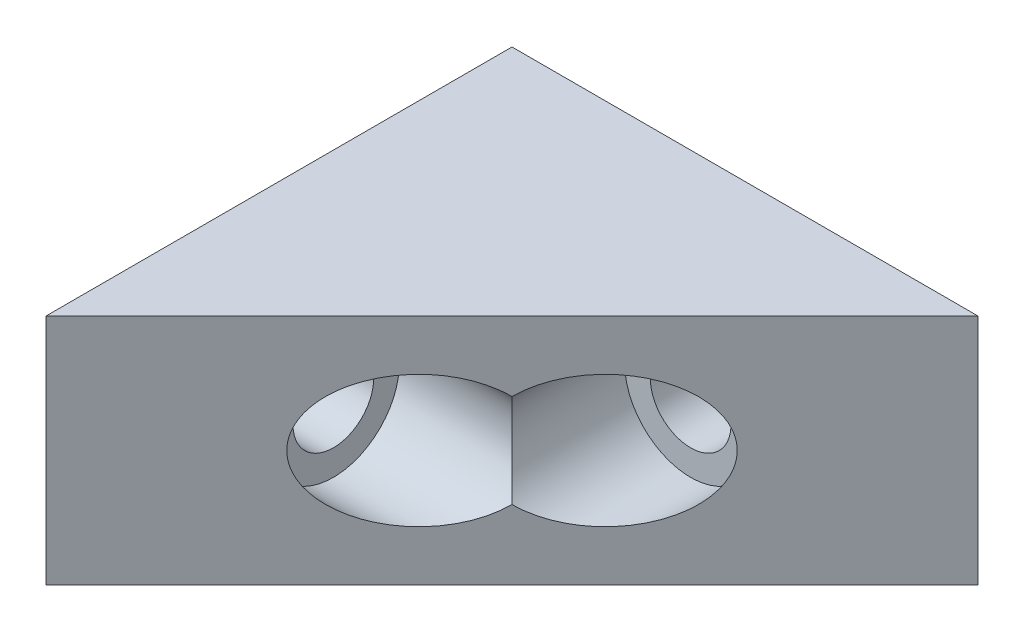
ISO-10303-21;
HEADER;
FILE_DESCRIPTION(('STEP AP214'),'2;1');
FILE_NAME('part.step','',(''),(''),'','','');
FILE_SCHEMA(('AUTOMOTIVE_DESIGN { 1 0 10303 214 1 1 1 1 }'));
ENDSEC;
DATA;
#1=APPLICATION_CONTEXT('core data for automotive mechanical design processes');
#2=APPLICATION_PROTOCOL_DEFINITION('international standard','automotive_design',2000,#1);
#3=PRODUCT_CONTEXT('',#1,'mechanical');
#4=PRODUCT('Part','Part','',(#3));
#5=PRODUCT_RELATED_PRODUCT_CATEGORY('part','',(#4));
#6=PRODUCT_DEFINITION_FORMATION('','',#4);
#7=PRODUCT_DEFINITION_CONTEXT('part definition',#1,'design');
#8=PRODUCT_DEFINITION('design','',#6,#7);
#9=PRODUCT_DEFINITION_SHAPE('','',#8);
#10=(LENGTH_UNIT() NAMED_UNIT(*) SI_UNIT(.MILLI.,.METRE.));
#11=(NAMED_UNIT(*) PLANE_ANGLE_UNIT() SI_UNIT($,.RADIAN.));
#12=(NAMED_UNIT(*) SI_UNIT($,.STERADIAN.) SOLID_ANGLE_UNIT());
#13=UNCERTAINTY_MEASURE_WITH_UNIT(LENGTH_MEASURE(1.E-05),#10,'distance_accuracy_value','');
#14=(GEOMETRIC_REPRESENTATION_CONTEXT(3) GLOBAL_UNCERTAINTY_ASSIGNED_CONTEXT((#13)) GLOBAL_UNIT_ASSIGNED_CONTEXT((#10,
#11,#12)) REPRESENTATION_CONTEXT('',''));
#15=CARTESIAN_POINT('',(0.,0.,0.));
#16=DIRECTION('',(0.,0.,1.));
#17=DIRECTION('',(1.,0.,0.));
#18=AXIS2_PLACEMENT_3D('',#15,#16,#17);
#19=CARTESIAN_POINT('',(-8.625,7.5,12.225));
#20=DIRECTION('',(1.,0.,0.));
#21=DIRECTION('',(0.,0.,-1.));
#22=AXIS2_PLACEMENT_3D('',#19,#20,#21);
#23=CYLINDRICAL_SURFACE('',#22,4.25);
#24=CARTESIAN_POINT('',(-8.625,7.5,12.225));
#25=DIRECTION('',(-1.,0.,0.));
#26=DIRECTION('',(0.,0.,1.));
#27=AXIS2_PLACEMENT_3D('',#24,#25,#26);
#28=CIRCLE('',#27,4.25);
#29=CARTESIAN_POINT('',(-8.625,7.5,16.475));
#30=VERTEX_POINT('',#29);
#31=EDGE_CURVE('E100',#30,#30,#28,.T.);
#32=ORIENTED_EDGE('',*,*,#31,.T.);
#33=EDGE_LOOP('',(#32));
#34=FACE_BOUND('',#33,.T.);
#35=CARTESIAN_POINT('',(-3.12499999999999,7.5,12.225));
#36=DIRECTION('',(-0.707106781186548,0.,-0.707106781186547));
#37=DIRECTION('',(0.707106781186547,0.,-0.707106781186548));
#38=AXIS2_PLACEMENT_3D('',#35,#36,#37);
#39=ELLIPSE('',#38,6.01040764008565,4.25);
#40=CARTESIAN_POINT('',(-0.124999999999998,10.5103986446981,9.22500000000002));
#41=VERTEX_POINT('',#40);
#42=CARTESIAN_POINT('',(-0.124999999999998,4.48960135530192,9.22500000000002));
#43=VERTEX_POINT('',#42);
#44=EDGE_CURVE('E94',#41,#43,#39,.F.);
#45=ORIENTED_EDGE('',*,*,#44,.T.);
#46=CARTESIAN_POINT('',(2.875,7.5,12.225));
#47=DIRECTION('',(0.707106781186547,0.,-0.707106781186548));
#48=DIRECTION('',(0.707106781186548,0.,0.707106781186547));
#49=AXIS2_PLACEMENT_3D('',#46,#47,#48);
#50=ELLIPSE('',#49,6.01040764008565,4.25);
#51=EDGE_CURVE('E11',#43,#41,#50,.T.);
#52=ORIENTED_EDGE('',*,*,#51,.T.);
#53=EDGE_LOOP('',(#45,#52));
#54=FACE_BOUND('',#53,.T.);
#55=ADVANCED_FACE('F39',(#34,#54),#23,.F.);
#56=CARTESIAN_POINT('',(2.875,7.5,24.225));
#57=DIRECTION('',(0.,0.,-1.));
#58=DIRECTION('',(-1.,0.,0.));
#59=AXIS2_PLACEMENT_3D('',#56,#57,#58);
#60=CYLINDRICAL_SURFACE('',#59,2.6);
#61=CARTESIAN_POINT('',(2.875,7.5,0.725000000000024));
#62=DIRECTION('',(0.,0.,-1.));
#63=DIRECTION('',(-1.,0.,0.));
#64=AXIS2_PLACEMENT_3D('',#61,#62,#63);
#65=CIRCLE('',#64,2.6);
#66=CARTESIAN_POINT('',(0.274999999999996,7.5,0.725000000000024));
#67=VERTEX_POINT('',#66);
#68=EDGE_CURVE('E43',#67,#67,#65,.F.);
#69=ORIENTED_EDGE('',*,*,#68,.T.);
#70=EDGE_LOOP('',(#69));
#71=FACE_BOUND('',#70,.T.);
#72=CARTESIAN_POINT('',(2.875,7.5,-5.77499999999998));
#73=DIRECTION('',(0.,0.,-1.));
#74=DIRECTION('',(-1.,0.,0.));
#75=AXIS2_PLACEMENT_3D('',#72,#73,#74);
#76=CIRCLE('',#75,2.6);
#77=CARTESIAN_POINT('',(0.274999999999996,7.5,-5.77499999999998));
#78=VERTEX_POINT('',#77);
#79=EDGE_CURVE('E105',#78,#78,#76,.T.);
#80=ORIENTED_EDGE('',*,*,#79,.T.);
#81=EDGE_LOOP('',(#80));
#82=FACE_BOUND('',#81,.T.);
#83=ADVANCED_FACE('F161',(#71,#82),#60,.F.);
#84=CARTESIAN_POINT('',(-15.125,15.,-5.77499999999998));
#85=DIRECTION('',(1.,0.,0.));
#86=DIRECTION('',(0.,0.,-1.));
#87=AXIS2_PLACEMENT_3D('',#84,#85,#86);
#88=PLANE('',#87);
#89=CARTESIAN_POINT('',(-15.125,7.5,12.225));
#90=DIRECTION('',(-1.,0.,0.));
#91=DIRECTION('',(0.,0.,1.));
#92=AXIS2_PLACEMENT_3D('',#89,#90,#91);
#93=CIRCLE('',#92,2.6);
#94=CARTESIAN_POINT('',(-15.125,7.5,14.825));
#95=VERTEX_POINT('',#94);
#96=EDGE_CURVE('E113',#95,#95,#93,.T.);
#97=ORIENTED_EDGE('',*,*,#96,.F.);
#98=EDGE_LOOP('',(#97));
#99=FACE_BOUND('',#98,.T.);
#100=DIRECTION('',(0.,0.,1.));
#101=VECTOR('',#100,1.);
#102=CARTESIAN_POINT('',(-15.125,0.,-5.77499999999998));
#103=LINE('',#102,#101);
#104=CARTESIAN_POINT('',(-15.125,0.,-5.77499999999998));
#105=VERTEX_POINT('',#104);
#106=CARTESIAN_POINT('',(-15.125,0.,24.225));
#107=VERTEX_POINT('',#106);
#108=EDGE_CURVE('E117',#105,#107,#103,.T.);
#109=ORIENTED_EDGE('',*,*,#108,.T.);
#110=DIRECTION('',(0.,-1.,0.));
#111=VECTOR('',#110,1.);
#112=CARTESIAN_POINT('',(-15.125,15.,24.225));
#113=LINE('',#112,#111);
#114=CARTESIAN_POINT('',(-15.125,15.,24.225));
#115=VERTEX_POINT('',#114);
#116=EDGE_CURVE('E49',#115,#107,#113,.T.);
#117=ORIENTED_EDGE('',*,*,#116,.F.);
#118=DIRECTION('',(0.,0.,1.));
#119=VECTOR('',#118,1.);
#120=CARTESIAN_POINT('',(-15.125,15.,-5.77499999999998));
#121=LINE('',#120,#119);
#122=CARTESIAN_POINT('',(-15.125,15.,-5.77499999999998));
#123=VERTEX_POINT('',#122);
#124=EDGE_CURVE('E118',#123,#115,#121,.T.);
#125=ORIENTED_EDGE('',*,*,#124,.F.);
#126=DIRECTION('',(0.,-1.,0.));
#127=VECTOR('',#126,1.);
#128=CARTESIAN_POINT('',(-15.125,15.,-5.77499999999998));
#129=LINE('',#128,#127);
#130=EDGE_CURVE('E125',#123,#105,#129,.T.);
#131=ORIENTED_EDGE('',*,*,#130,.T.);
#132=EDGE_LOOP('',(#109,#117,#125,#131));
#133=FACE_BOUND('',#132,.T.);
#134=ADVANCED_FACE('F41',(#99,#133),#88,.F.);
#135=CARTESIAN_POINT('',(14.875,15.,-5.77499999999998));
#136=DIRECTION('',(-0.707106781186548,0.,-0.707106781186547));
#137=DIRECTION('',(-0.707106781186547,0.,0.707106781186548));
#138=AXIS2_PLACEMENT_3D('',#135,#136,#137);
#139=PLANE('',#138);
#140=CARTESIAN_POINT('',(2.875,7.5,6.22500000000003));
#141=DIRECTION('',(-0.707106781186548,0.,-0.707106781186547));
#142=DIRECTION('',(-0.707106781186547,0.,0.707106781186548));
#143=AXIS2_PLACEMENT_3D('',#140,#141,#142);
#144=ELLIPSE('',#143,6.01040764008566,4.25);
#145=EDGE_CURVE('E55',#43,#41,#144,.F.);
#146=ORIENTED_EDGE('',*,*,#145,.F.);
#147=ORIENTED_EDGE('',*,*,#44,.F.);
#148=EDGE_LOOP('',(#146,#147));
#149=FACE_BOUND('',#148,.T.);
#150=DIRECTION('',(0.707106781186547,0.,-0.707106781186548));
#151=VECTOR('',#150,1.);
#152=CARTESIAN_POINT('',(14.875,0.,-5.77499999999998));
#153=LINE('',#152,#151);
#154=CARTESIAN_POINT('',(14.875,0.,-5.77499999999998));
#155=VERTEX_POINT('',#154);
#156=EDGE_CURVE('E129',#107,#155,#153,.T.);
#157=ORIENTED_EDGE('',*,*,#156,.T.);
#158=DIRECTION('',(0.,-1.,0.));
#159=VECTOR('',#158,1.);
#160=CARTESIAN_POINT('',(14.875,15.,-5.77499999999998));
#161=LINE('',#160,#159);
#162=CARTESIAN_POINT('',(14.875,15.,-5.77499999999998));
#163=VERTEX_POINT('',#162);
#164=EDGE_CURVE('E136',#163,#155,#161,.T.);
#165=ORIENTED_EDGE('',*,*,#164,.F.);
#166=DIRECTION('',(0.707106781186547,0.,-0.707106781186548));
#167=VECTOR('',#166,1.);
#168=CARTESIAN_POINT('',(14.875,15.,-5.77499999999998));
#169=LINE('',#168,#167);
#170=EDGE_CURVE('E86',#115,#163,#169,.T.);
#171=ORIENTED_EDGE('',*,*,#170,.F.);
#172=ORIENTED_EDGE('',*,*,#116,.T.);
#173=EDGE_LOOP('',(#157,#165,#171,#172));
#174=FACE_BOUND('',#173,.T.);
#175=ADVANCED_FACE('F93',(#149,#174),#139,.F.);
#176=CARTESIAN_POINT('',(-15.125,15.,-5.77499999999998));
#177=DIRECTION('',(0.,0.,1.));
#178=DIRECTION('',(1.,0.,0.));
#179=AXIS2_PLACEMENT_3D('',#176,#177,#178);
#180=PLANE('',#179);
#181=ORIENTED_EDGE('',*,*,#79,.F.);
#182=EDGE_LOOP('',(#181));
#183=FACE_BOUND('',#182,.T.);
#184=DIRECTION('',(-1.,0.,0.));
#185=VECTOR('',#184,1.);
#186=CARTESIAN_POINT('',(-15.125,0.,-5.77499999999998));
#187=LINE('',#186,#185);
#188=EDGE_CURVE('E80',#155,#105,#187,.T.);
#189=ORIENTED_EDGE('',*,*,#188,.T.);
#190=ORIENTED_EDGE('',*,*,#130,.F.);
#191=DIRECTION('',(-1.,0.,0.));
#192=VECTOR('',#191,1.);
#193=CARTESIAN_POINT('',(-15.125,15.,-5.77499999999998));
#194=LINE('',#193,#192);
#195=EDGE_CURVE('E63',#163,#123,#194,.T.);
#196=ORIENTED_EDGE('',*,*,#195,.F.);
#197=ORIENTED_EDGE('',*,*,#164,.T.);
#198=EDGE_LOOP('',(#189,#190,#196,#197));
#199=FACE_BOUND('',#198,.T.);
#200=ADVANCED_FACE('F157',(#183,#199),#180,.F.);
#201=CARTESIAN_POINT('',(0.,15.,0.));
#202=DIRECTION('',(0.,1.,0.));
#203=DIRECTION('',(0.,0.,1.));
#204=AXIS2_PLACEMENT_3D('',#201,#202,#203);
#205=PLANE('',#204);
#206=ORIENTED_EDGE('',*,*,#124,.T.);
#207=ORIENTED_EDGE('',*,*,#170,.T.);
#208=ORIENTED_EDGE('',*,*,#195,.T.);
#209=EDGE_LOOP('',(#206,#207,#208));
#210=FACE_BOUND('',#209,.T.);
#211=ADVANCED_FACE('F148',(#210),#205,.T.);
#212=CARTESIAN_POINT('',(0.,0.,0.));
#213=DIRECTION('',(0.,1.,0.));
#214=DIRECTION('',(0.,0.,1.));
#215=AXIS2_PLACEMENT_3D('',#212,#213,#214);
#216=PLANE('',#215);
#217=ORIENTED_EDGE('',*,*,#108,.F.);
#218=ORIENTED_EDGE('',*,*,#188,.F.);
#219=ORIENTED_EDGE('',*,*,#156,.F.);
#220=EDGE_LOOP('',(#217,#218,#219));
#221=FACE_BOUND('',#220,.T.);
#222=ADVANCED_FACE('F145',(#221),#216,.F.);
#223=CARTESIAN_POINT('',(14.875,7.5,12.225));
#224=DIRECTION('',(-1.,0.,0.));
#225=DIRECTION('',(0.,0.,1.));
#226=AXIS2_PLACEMENT_3D('',#223,#224,#225);
#227=CYLINDRICAL_SURFACE('',#226,2.6);
#228=CARTESIAN_POINT('',(-8.625,7.5,12.225));
#229=DIRECTION('',(-1.,0.,0.));
#230=DIRECTION('',(0.,0.,1.));
#231=AXIS2_PLACEMENT_3D('',#228,#229,#230);
#232=CIRCLE('',#231,2.6);
#233=CARTESIAN_POINT('',(-8.62499999999999,7.5,14.825));
#234=VERTEX_POINT('',#233);
#235=EDGE_CURVE('E99',#234,#234,#232,.F.);
#236=CARTESIAN_POINT('',(-8.62499999999999,7.5,14.825));
#237=CARTESIAN_POINT('',(-8.69270833333333,7.5,14.825));
#238=CARTESIAN_POINT('',(-8.76041666666666,7.5,14.825));
#239=CARTESIAN_POINT('',(-8.89583333333333,7.5,14.825));
#240=CARTESIAN_POINT('',(-8.96354166666666,7.5,14.825));
#241=CARTESIAN_POINT('',(-9.09895833333333,7.5,14.825));
#242=CARTESIAN_POINT('',(-9.16666666666666,7.5,14.825));
#243=CARTESIAN_POINT('',(-9.30208333333333,7.5,14.825));
#244=CARTESIAN_POINT('',(-9.36979166666666,7.5,14.825));
#245=CARTESIAN_POINT('',(-9.50520833333333,7.5,14.825));
#246=CARTESIAN_POINT('',(-9.57291666666666,7.5,14.825));
#247=CARTESIAN_POINT('',(-9.70833333333333,7.5,14.825));
#248=CARTESIAN_POINT('',(-9.77604166666666,7.5,14.825));
#249=CARTESIAN_POINT('',(-9.91145833333333,7.5,14.825));
#250=CARTESIAN_POINT('',(-9.97916666666666,7.5,14.825));
#251=CARTESIAN_POINT('',(-10.1145833333333,7.5,14.825));
#252=CARTESIAN_POINT('',(-10.1822916666667,7.5,14.825));
#253=CARTESIAN_POINT('',(-10.3177083333333,7.5,14.825));
#254=CARTESIAN_POINT('',(-10.3854166666667,7.5,14.825));
#255=CARTESIAN_POINT('',(-10.5208333333333,7.5,14.825));
#256=CARTESIAN_POINT('',(-10.5885416666667,7.5,14.825));
#257=CARTESIAN_POINT('',(-10.7239583333333,7.5,14.825));
#258=CARTESIAN_POINT('',(-10.7916666666667,7.5,14.825));
#259=CARTESIAN_POINT('',(-10.9270833333333,7.5,14.825));
#260=CARTESIAN_POINT('',(-10.9947916666667,7.5,14.825));
#261=CARTESIAN_POINT('',(-11.1302083333333,7.5,14.825));
#262=CARTESIAN_POINT('',(-11.1979166666667,7.5,14.825));
#263=CARTESIAN_POINT('',(-11.3333333333333,7.5,14.825));
#264=CARTESIAN_POINT('',(-11.4010416666667,7.5,14.825));
#265=CARTESIAN_POINT('',(-11.5364583333333,7.5,14.825));
#266=CARTESIAN_POINT('',(-11.6041666666667,7.5,14.825));
#267=CARTESIAN_POINT('',(-11.7395833333333,7.5,14.825));
#268=CARTESIAN_POINT('',(-11.8072916666667,7.5,14.825));
#269=CARTESIAN_POINT('',(-11.9427083333333,7.5,14.825));
#270=CARTESIAN_POINT('',(-12.0104166666667,7.5,14.825));
#271=CARTESIAN_POINT('',(-12.1458333333333,7.5,14.825));
#272=CARTESIAN_POINT('',(-12.2135416666667,7.5,14.825));
#273=CARTESIAN_POINT('',(-12.3489583333333,7.5,14.825));
#274=CARTESIAN_POINT('',(-12.4166666666667,7.5,14.825));
#275=CARTESIAN_POINT('',(-12.5520833333333,7.5,14.825));
#276=CARTESIAN_POINT('',(-12.6197916666667,7.5,14.825));
#277=CARTESIAN_POINT('',(-12.7552083333333,7.5,14.825));
#278=CARTESIAN_POINT('',(-12.8229166666667,7.5,14.825));
#279=CARTESIAN_POINT('',(-12.9583333333333,7.5,14.825));
#280=CARTESIAN_POINT('',(-13.0260416666667,7.5,14.825));
#281=CARTESIAN_POINT('',(-13.1614583333333,7.5,14.825));
#282=CARTESIAN_POINT('',(-13.2291666666667,7.5,14.825));
#283=CARTESIAN_POINT('',(-13.3645833333333,7.5,14.825));
#284=CARTESIAN_POINT('',(-13.4322916666667,7.5,14.825));
#285=CARTESIAN_POINT('',(-13.5677083333333,7.5,14.825));
#286=CARTESIAN_POINT('',(-13.6354166666667,7.5,14.825));
#287=CARTESIAN_POINT('',(-13.7708333333333,7.5,14.825));
#288=CARTESIAN_POINT('',(-13.8385416666667,7.5,14.825));
#289=CARTESIAN_POINT('',(-13.9739583333333,7.5,14.825));
#290=CARTESIAN_POINT('',(-14.0416666666667,7.5,14.825));
#291=CARTESIAN_POINT('',(-14.1770833333333,7.5,14.825));
#292=CARTESIAN_POINT('',(-14.2447916666667,7.5,14.825));
#293=CARTESIAN_POINT('',(-14.3802083333333,7.5,14.825));
#294=CARTESIAN_POINT('',(-14.4479166666667,7.5,14.825));
#295=CARTESIAN_POINT('',(-14.5833333333333,7.5,14.825));
#296=CARTESIAN_POINT('',(-14.6510416666667,7.5,14.825));
#297=CARTESIAN_POINT('',(-14.7864583333333,7.5,14.825));
#298=CARTESIAN_POINT('',(-14.8541666666667,7.5,14.825));
#299=CARTESIAN_POINT('',(-14.9895833333333,7.5,14.825));
#300=CARTESIAN_POINT('',(-15.0572916666667,7.5,14.825));
#301=CARTESIAN_POINT('',(-15.125,7.5,14.825));
#302=B_SPLINE_CURVE_WITH_KNOTS('',3,(#236,#237,#238,#239,#240,#241,#242,#243,#244,#245,#246,
#247,#248,#249,#250,#251,#252,#253,#254,#255,#256,#257,#258,#259,#260,#261,#262,#263,#264,#265,
#266,#267,#268,#269,#270,#271,#272,#273,#274,#275,#276,#277,#278,#279,#280,#281,#282,#283,#284,
#285,#286,#287,#288,#289,#290,#291,#292,#293,#294,#295,#296,#297,#298,#299,#300,#301),
.UNSPECIFIED.,.F.,.F.,(4,2,2,2,2,2,2,2,2,2,2,2,2,2,2,2,2,2,2,2,2,2,2,2,2,2,2,2,2,2,2,2,4),(0.,
0.203124999999998,0.40625,0.609375000000002,0.812500000000001,1.015625,1.21875,1.421875,1.625,
1.828125,2.03125,2.234375,2.4375,2.640625,2.84375,3.046875,3.25,3.453125,3.65625,
3.85937500000001,4.0625,4.265625,4.46875,4.67187500000001,4.875,5.078125,5.28125,
5.48437500000001,5.68750000000001,5.890625,6.09375000000001,6.29687500000001,6.50000000000001),.UNSPECIFIED.);
#303=EDGE_CURVE('BSEAM147',#234,#95,#302,.T.);
#304=ORIENTED_EDGE('',*,*,#235,.T.);
#305=ORIENTED_EDGE('',*,*,#96,.T.);
#306=ORIENTED_EDGE('',*,*,#303,.T.);
#307=ORIENTED_EDGE('',*,*,#303,.F.);
#308=EDGE_LOOP('',(#304,#306,#305,#307));
#309=FACE_BOUND('',#308,.T.);
#310=ADVANCED_FACE('F147',(#309),#227,.F.);
#311=CARTESIAN_POINT('',(-8.625,7.5,12.225));
#312=DIRECTION('',(-1.,0.,0.));
#313=DIRECTION('',(0.,0.,1.));
#314=AXIS2_PLACEMENT_3D('',#311,#312,#313);
#315=PLANE('',#314);
#316=ORIENTED_EDGE('',*,*,#31,.F.);
#317=EDGE_LOOP('',(#316));
#318=FACE_BOUND('',#317,.T.);
#319=ORIENTED_EDGE('',*,*,#235,.F.);
#320=EDGE_LOOP('',(#319));
#321=FACE_BOUND('',#320,.T.);
#322=ADVANCED_FACE('F154',(#318,#321),#315,.F.);
#323=CARTESIAN_POINT('',(2.875,7.5,0.725000000000024));
#324=DIRECTION('',(0.,0.,-1.));
#325=DIRECTION('',(-1.,0.,0.));
#326=AXIS2_PLACEMENT_3D('',#323,#324,#325);
#327=PLANE('',#326);
#328=CARTESIAN_POINT('',(2.875,7.5,0.725000000000024));
#329=DIRECTION('',(0.,0.,-1.));
#330=DIRECTION('',(-1.,0.,0.));
#331=AXIS2_PLACEMENT_3D('',#328,#329,#330);
#332=CIRCLE('',#331,4.25);
#333=CARTESIAN_POINT('',(-1.375,7.5,0.725000000000024));
#334=VERTEX_POINT('',#333);
#335=EDGE_CURVE('E96',#334,#334,#332,.T.);
#336=ORIENTED_EDGE('',*,*,#335,.F.);
#337=EDGE_LOOP('',(#336));
#338=FACE_BOUND('',#337,.T.);
#339=ORIENTED_EDGE('',*,*,#68,.F.);
#340=EDGE_LOOP('',(#339));
#341=FACE_BOUND('',#340,.T.);
#342=ADVANCED_FACE('F172',(#338,#341),#327,.F.);
#343=CARTESIAN_POINT('',(2.875,7.5,0.725000000000024));
#344=DIRECTION('',(0.,0.,1.));
#345=DIRECTION('',(1.,0.,0.));
#346=AXIS2_PLACEMENT_3D('',#343,#344,#345);
#347=CYLINDRICAL_SURFACE('',#346,4.25);
#348=ORIENTED_EDGE('',*,*,#335,.T.);
#349=EDGE_LOOP('',(#348));
#350=FACE_BOUND('',#349,.T.);
#351=ORIENTED_EDGE('',*,*,#145,.T.);
#352=ORIENTED_EDGE('',*,*,#51,.F.);
#353=EDGE_LOOP('',(#351,#352));
#354=FACE_BOUND('',#353,.T.);
#355=ADVANCED_FACE('F88',(#350,#354),#347,.F.);
#356=CLOSED_SHELL('',(#55,#83,#134,#175,#200,#211,#222,#310,#322,#342,#355));
#357=MANIFOLD_SOLID_BREP('B2',#356);
#358=ADVANCED_BREP_SHAPE_REPRESENTATION('',(#18,#357),#14);
#359=SHAPE_DEFINITION_REPRESENTATION(#9,#358);
ENDSEC;
END-ISO-10303-21;
